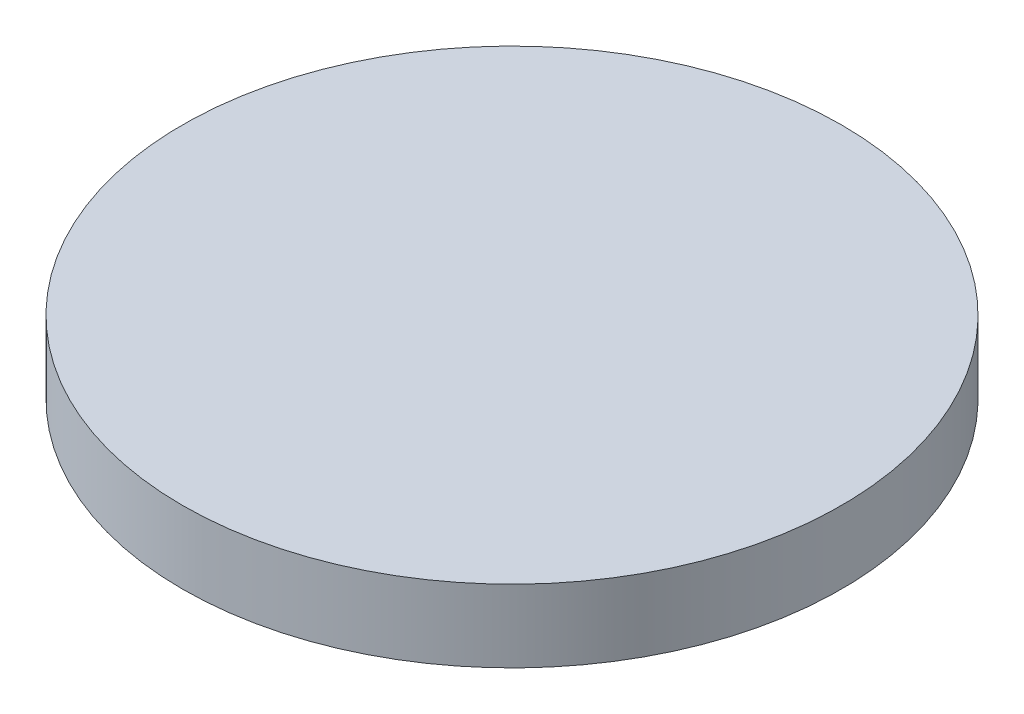
ISO-10303-21;
HEADER;
FILE_DESCRIPTION(('STEP AP214'),'2;1');
FILE_NAME('part.step','',(''),(''),'','','');
FILE_SCHEMA(('AUTOMOTIVE_DESIGN { 1 0 10303 214 1 1 1 1 }'));
ENDSEC;
DATA;
#1=APPLICATION_CONTEXT('core data for automotive mechanical design processes');
#2=APPLICATION_PROTOCOL_DEFINITION('international standard','automotive_design',2000,#1);
#3=PRODUCT_CONTEXT('',#1,'mechanical');
#4=PRODUCT('Part','Part','',(#3));
#5=PRODUCT_RELATED_PRODUCT_CATEGORY('part','',(#4));
#6=PRODUCT_DEFINITION_FORMATION('','',#4);
#7=PRODUCT_DEFINITION_CONTEXT('part definition',#1,'design');
#8=PRODUCT_DEFINITION('design','',#6,#7);
#9=PRODUCT_DEFINITION_SHAPE('','',#8);
#10=(LENGTH_UNIT() NAMED_UNIT(*) SI_UNIT(.MILLI.,.METRE.));
#11=(NAMED_UNIT(*) PLANE_ANGLE_UNIT() SI_UNIT($,.RADIAN.));
#12=(NAMED_UNIT(*) SI_UNIT($,.STERADIAN.) SOLID_ANGLE_UNIT());
#13=UNCERTAINTY_MEASURE_WITH_UNIT(LENGTH_MEASURE(1.E-05),#10,'distance_accuracy_value','');
#14=(GEOMETRIC_REPRESENTATION_CONTEXT(3) GLOBAL_UNCERTAINTY_ASSIGNED_CONTEXT((#13)) GLOBAL_UNIT_ASSIGNED_CONTEXT((#10,
#11,#12)) REPRESENTATION_CONTEXT('',''));
#15=CARTESIAN_POINT('',(0.,0.,0.));
#16=DIRECTION('',(0.,0.,1.));
#17=DIRECTION('',(1.,0.,0.));
#18=AXIS2_PLACEMENT_3D('',#15,#16,#17);
#19=CARTESIAN_POINT('',(0.,5.5,0.));
#20=DIRECTION('',(0.,-1.,0.));
#21=DIRECTION('',(0.,0.,-1.));
#22=AXIS2_PLACEMENT_3D('',#19,#20,#21);
#23=CYLINDRICAL_SURFACE('',#22,25.);
#24=CARTESIAN_POINT('',(0.,5.5,0.));
#25=DIRECTION('',(0.,1.,0.));
#26=DIRECTION('',(0.,0.,1.));
#27=AXIS2_PLACEMENT_3D('',#24,#25,#26);
#28=CIRCLE('',#27,25.);
#29=CARTESIAN_POINT('',(0.,5.5,25.));
#30=VERTEX_POINT('',#29);
#31=EDGE_CURVE('E11',#30,#30,#28,.T.);
#32=ORIENTED_EDGE('',*,*,#31,.F.);
#33=EDGE_LOOP('',(#32));
#34=FACE_BOUND('',#33,.T.);
#35=CARTESIAN_POINT('',(0.,0.,0.));
#36=DIRECTION('',(0.,1.,0.));
#37=DIRECTION('',(0.,0.,1.));
#38=AXIS2_PLACEMENT_3D('',#35,#36,#37);
#39=CIRCLE('',#38,25.);
#40=CARTESIAN_POINT('',(0.,0.,25.));
#41=VERTEX_POINT('',#40);
#42=EDGE_CURVE('E36',#41,#41,#39,.T.);
#43=ORIENTED_EDGE('',*,*,#42,.T.);
#44=EDGE_LOOP('',(#43));
#45=FACE_BOUND('',#44,.T.);
#46=ADVANCED_FACE('F33',(#34,#45),#23,.T.);
#47=CARTESIAN_POINT('',(0.,5.5,0.));
#48=DIRECTION('',(0.,1.,0.));
#49=DIRECTION('',(0.,0.,1.));
#50=AXIS2_PLACEMENT_3D('',#47,#48,#49);
#51=PLANE('',#50);
#52=ORIENTED_EDGE('',*,*,#31,.T.);
#53=EDGE_LOOP('',(#52));
#54=FACE_BOUND('',#53,.T.);
#55=ADVANCED_FACE('F85',(#54),#51,.T.);
#56=CARTESIAN_POINT('',(0.,0.,0.));
#57=DIRECTION('',(0.,1.,0.));
#58=DIRECTION('',(0.,0.,1.));
#59=AXIS2_PLACEMENT_3D('',#56,#57,#58);
#60=PLANE('',#59);
#61=CARTESIAN_POINT('',(0.,0.,0.));
#62=DIRECTION('',(0.,-1.,0.));
#63=DIRECTION('',(0.,0.,-1.));
#64=AXIS2_PLACEMENT_3D('',#61,#62,#63);
#65=CIRCLE('',#64,24.);
#66=CARTESIAN_POINT('',(0.,0.,-24.));
#67=VERTEX_POINT('',#66);
#68=EDGE_CURVE('E47',#67,#67,#65,.T.);
#69=ORIENTED_EDGE('',*,*,#68,.F.);
#70=EDGE_LOOP('',(#69));
#71=FACE_BOUND('',#70,.T.);
#72=ORIENTED_EDGE('',*,*,#42,.F.);
#73=EDGE_LOOP('',(#72));
#74=FACE_BOUND('',#73,.T.);
#75=ADVANCED_FACE('F70',(#71,#74),#60,.F.);
#76=CARTESIAN_POINT('',(0.,3.5,0.));
#77=DIRECTION('',(0.,1.,0.));
#78=DIRECTION('',(0.,0.,1.));
#79=AXIS2_PLACEMENT_3D('',#76,#77,#78);
#80=PLANE('',#79);
#81=CARTESIAN_POINT('',(0.,3.5,0.));
#82=DIRECTION('',(0.,-1.,0.));
#83=DIRECTION('',(0.,0.,-1.));
#84=AXIS2_PLACEMENT_3D('',#81,#82,#83);
#85=CIRCLE('',#84,20.4);
#86=CARTESIAN_POINT('',(0.,3.5,-20.4));
#87=VERTEX_POINT('',#86);
#88=EDGE_CURVE('E57',#87,#87,#85,.T.);
#89=ORIENTED_EDGE('',*,*,#88,.F.);
#90=EDGE_LOOP('',(#89));
#91=FACE_BOUND('',#90,.T.);
#92=CARTESIAN_POINT('',(0.,3.5,0.));
#93=DIRECTION('',(0.,1.,0.));
#94=DIRECTION('',(0.,0.,1.));
#95=AXIS2_PLACEMENT_3D('',#92,#93,#94);
#96=CIRCLE('',#95,24.);
#97=CARTESIAN_POINT('',(0.,3.5,24.));
#98=VERTEX_POINT('',#97);
#99=EDGE_CURVE('E43',#98,#98,#96,.F.);
#100=ORIENTED_EDGE('',*,*,#99,.T.);
#101=EDGE_LOOP('',(#100));
#102=FACE_BOUND('',#101,.T.);
#103=ADVANCED_FACE('F66',(#91,#102),#80,.F.);
#104=CARTESIAN_POINT('',(0.,73.3822509939086,0.));
#105=DIRECTION('',(0.,-1.,0.));
#106=DIRECTION('',(0.,0.,-1.));
#107=AXIS2_PLACEMENT_3D('',#104,#105,#106);
#108=CYLINDRICAL_SURFACE('',#107,24.);
#109=ORIENTED_EDGE('',*,*,#68,.T.);
#110=EDGE_LOOP('',(#109));
#111=FACE_BOUND('',#110,.T.);
#112=ORIENTED_EDGE('',*,*,#99,.F.);
#113=EDGE_LOOP('',(#112));
#114=FACE_BOUND('',#113,.T.);
#115=ADVANCED_FACE('F69',(#111,#114),#108,.F.);
#116=CARTESIAN_POINT('',(0.,63.1999133448223,0.));
#117=DIRECTION('',(0.,-1.,0.));
#118=DIRECTION('',(0.,0.,-1.));
#119=AXIS2_PLACEMENT_3D('',#116,#117,#118);
#120=CYLINDRICAL_SURFACE('',#119,20.4);
#121=ORIENTED_EDGE('',*,*,#88,.T.);
#122=EDGE_LOOP('',(#121));
#123=FACE_BOUND('',#122,.T.);
#124=CARTESIAN_POINT('',(0.,4.5,0.));
#125=DIRECTION('',(0.,1.,0.));
#126=DIRECTION('',(0.,0.,1.));
#127=AXIS2_PLACEMENT_3D('',#124,#125,#126);
#128=CIRCLE('',#127,20.4);
#129=CARTESIAN_POINT('',(0.,4.5,20.4));
#130=VERTEX_POINT('',#129);
#131=EDGE_CURVE('E51',#130,#130,#128,.F.);
#132=ORIENTED_EDGE('',*,*,#131,.F.);
#133=EDGE_LOOP('',(#132));
#134=FACE_BOUND('',#133,.T.);
#135=ADVANCED_FACE('F63',(#123,#134),#120,.F.);
#136=CARTESIAN_POINT('',(0.,63.1999133448223,0.));
#137=DIRECTION('',(0.,-1.,0.));
#138=DIRECTION('',(0.,0.,-1.));
#139=AXIS2_PLACEMENT_3D('',#136,#137,#138);
#140=CYLINDRICAL_SURFACE('',#139,19.9);
#141=CARTESIAN_POINT('',(0.,3.5,0.));
#142=DIRECTION('',(0.,-1.,0.));
#143=DIRECTION('',(0.,0.,-1.));
#144=AXIS2_PLACEMENT_3D('',#141,#142,#143);
#145=CIRCLE('',#144,19.9);
#146=CARTESIAN_POINT('',(0.,3.5,-19.9));
#147=VERTEX_POINT('',#146);
#148=EDGE_CURVE('E54',#147,#147,#145,.T.);
#149=ORIENTED_EDGE('',*,*,#148,.F.);
#150=EDGE_LOOP('',(#149));
#151=FACE_BOUND('',#150,.T.);
#152=CARTESIAN_POINT('',(0.,4.5,0.));
#153=DIRECTION('',(0.,1.,0.));
#154=DIRECTION('',(0.,0.,1.));
#155=AXIS2_PLACEMENT_3D('',#152,#153,#154);
#156=CIRCLE('',#155,19.9);
#157=CARTESIAN_POINT('',(0.,4.5,19.9));
#158=VERTEX_POINT('',#157);
#159=EDGE_CURVE('E50',#158,#158,#156,.F.);
#160=ORIENTED_EDGE('',*,*,#159,.T.);
#161=EDGE_LOOP('',(#160));
#162=FACE_BOUND('',#161,.T.);
#163=ADVANCED_FACE('F81',(#151,#162),#140,.T.);
#164=CARTESIAN_POINT('',(0.,4.5,0.));
#165=DIRECTION('',(0.,1.,0.));
#166=DIRECTION('',(0.,0.,1.));
#167=AXIS2_PLACEMENT_3D('',#164,#165,#166);
#168=PLANE('',#167);
#169=ORIENTED_EDGE('',*,*,#131,.T.);
#170=EDGE_LOOP('',(#169));
#171=FACE_BOUND('',#170,.T.);
#172=ORIENTED_EDGE('',*,*,#159,.F.);
#173=EDGE_LOOP('',(#172));
#174=FACE_BOUND('',#173,.T.);
#175=ADVANCED_FACE('F123',(#171,#174),#168,.F.);
#176=ORIENTED_EDGE('',*,*,#148,.T.);
#177=EDGE_LOOP('',(#176));
#178=FACE_BOUND('',#177,.T.);
#179=ADVANCED_FACE('F72',(#178),#80,.F.);
#180=CLOSED_SHELL('',(#46,#55,#75,#103,#115,#135,#163,#175,#179));
#181=MANIFOLD_SOLID_BREP('B2',#180);
#182=ADVANCED_BREP_SHAPE_REPRESENTATION('',(#18,#181),#14);
#183=SHAPE_DEFINITION_REPRESENTATION(#9,#182);
ENDSEC;
END-ISO-10303-21;
